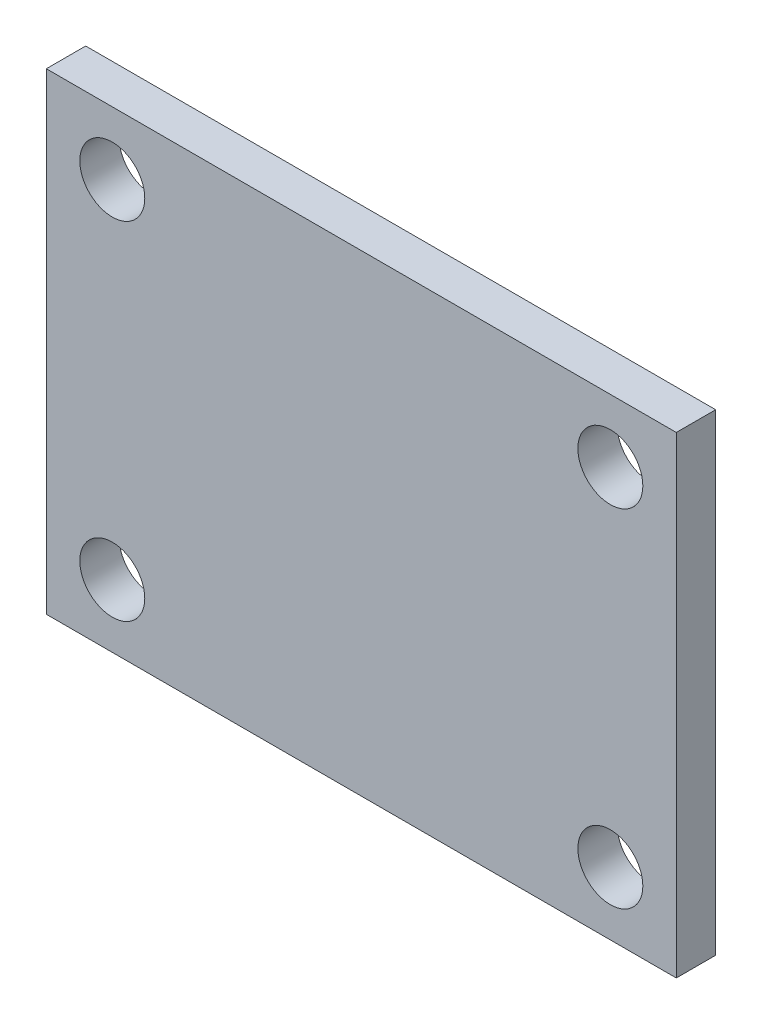
ISO-10303-21;
HEADER;
FILE_DESCRIPTION(('STEP AP214'),'2;1');
FILE_NAME('part.step','',(''),(''),'','','');
FILE_SCHEMA(('AUTOMOTIVE_DESIGN { 1 0 10303 214 1 1 1 1 }'));
ENDSEC;
DATA;
#1=APPLICATION_CONTEXT('core data for automotive mechanical design processes');
#2=APPLICATION_PROTOCOL_DEFINITION('international standard','automotive_design',2000,#1);
#3=PRODUCT_CONTEXT('',#1,'mechanical');
#4=PRODUCT('Part','Part','',(#3));
#5=PRODUCT_RELATED_PRODUCT_CATEGORY('part','',(#4));
#6=PRODUCT_DEFINITION_FORMATION('','',#4);
#7=PRODUCT_DEFINITION_CONTEXT('part definition',#1,'design');
#8=PRODUCT_DEFINITION('design','',#6,#7);
#9=PRODUCT_DEFINITION_SHAPE('','',#8);
#10=(LENGTH_UNIT() NAMED_UNIT(*) SI_UNIT(.MILLI.,.METRE.));
#11=(NAMED_UNIT(*) PLANE_ANGLE_UNIT() SI_UNIT($,.RADIAN.));
#12=(NAMED_UNIT(*) SI_UNIT($,.STERADIAN.) SOLID_ANGLE_UNIT());
#13=UNCERTAINTY_MEASURE_WITH_UNIT(LENGTH_MEASURE(1.E-05),#10,'distance_accuracy_value','');
#14=(GEOMETRIC_REPRESENTATION_CONTEXT(3) GLOBAL_UNCERTAINTY_ASSIGNED_CONTEXT((#13)) GLOBAL_UNIT_ASSIGNED_CONTEXT((#10,
#11,#12)) REPRESENTATION_CONTEXT('',''));
#15=CARTESIAN_POINT('',(0.,0.,0.));
#16=DIRECTION('',(0.,0.,1.));
#17=DIRECTION('',(1.,0.,0.));
#18=AXIS2_PLACEMENT_3D('',#15,#16,#17);
#19=CARTESIAN_POINT('',(0.,0.,2.));
#20=DIRECTION('',(0.,0.,-1.));
#21=DIRECTION('',(-1.,0.,0.));
#22=AXIS2_PLACEMENT_3D('',#19,#20,#21);
#23=PLANE('',#22);
#24=DIRECTION('',(0.,1.,0.));
#25=VECTOR('',#24,1.);
#26=CARTESIAN_POINT('',(16.,-12.,2.));
#27=LINE('',#26,#25);
#28=CARTESIAN_POINT('',(16.,-12.,2.));
#29=VERTEX_POINT('',#28);
#30=CARTESIAN_POINT('',(16.,12.,2.));
#31=VERTEX_POINT('',#30);
#32=EDGE_CURVE('E89',#29,#31,#27,.T.);
#33=ORIENTED_EDGE('',*,*,#32,.T.);
#34=DIRECTION('',(-1.,0.,0.));
#35=VECTOR('',#34,1.);
#36=CARTESIAN_POINT('',(-16.,12.,2.));
#37=LINE('',#36,#35);
#38=CARTESIAN_POINT('',(-16.,12.,2.));
#39=VERTEX_POINT('',#38);
#40=EDGE_CURVE('E84',#31,#39,#37,.T.);
#41=ORIENTED_EDGE('',*,*,#40,.T.);
#42=DIRECTION('',(0.,-1.,0.));
#43=VECTOR('',#42,1.);
#44=CARTESIAN_POINT('',(-16.,-12.,2.));
#45=LINE('',#44,#43);
#46=CARTESIAN_POINT('',(-16.,-12.,2.));
#47=VERTEX_POINT('',#46);
#48=EDGE_CURVE('E87',#39,#47,#45,.T.);
#49=ORIENTED_EDGE('',*,*,#48,.T.);
#50=DIRECTION('',(1.,0.,0.));
#51=VECTOR('',#50,1.);
#52=CARTESIAN_POINT('',(-16.,-12.,2.));
#53=LINE('',#52,#51);
#54=EDGE_CURVE('E54',#47,#29,#53,.T.);
#55=ORIENTED_EDGE('',*,*,#54,.T.);
#56=EDGE_LOOP('',(#33,#41,#49,#55));
#57=FACE_BOUND('',#56,.T.);
#58=CARTESIAN_POINT('',(-12.65,8.8,2.));
#59=DIRECTION('',(0.,0.,1.));
#60=DIRECTION('',(1.,0.,0.));
#61=AXIS2_PLACEMENT_3D('',#58,#59,#60);
#62=CIRCLE('',#61,1.65);
#63=CARTESIAN_POINT('',(-11.,8.8,2.));
#64=VERTEX_POINT('',#63);
#65=EDGE_CURVE('E104',#64,#64,#62,.T.);
#66=ORIENTED_EDGE('',*,*,#65,.F.);
#67=EDGE_LOOP('',(#66));
#68=FACE_BOUND('',#67,.T.);
#69=CARTESIAN_POINT('',(12.65,8.8,2.));
#70=DIRECTION('',(0.,0.,1.));
#71=DIRECTION('',(1.,0.,0.));
#72=AXIS2_PLACEMENT_3D('',#69,#70,#71);
#73=CIRCLE('',#72,1.65);
#74=CARTESIAN_POINT('',(14.3,8.8,2.));
#75=VERTEX_POINT('',#74);
#76=EDGE_CURVE('E119',#75,#75,#73,.T.);
#77=ORIENTED_EDGE('',*,*,#76,.F.);
#78=EDGE_LOOP('',(#77));
#79=FACE_BOUND('',#78,.T.);
#80=CARTESIAN_POINT('',(12.65,-8.8,2.));
#81=DIRECTION('',(0.,0.,1.));
#82=DIRECTION('',(1.,0.,0.));
#83=AXIS2_PLACEMENT_3D('',#80,#81,#82);
#84=CIRCLE('',#83,1.65);
#85=CARTESIAN_POINT('',(14.3,-8.8,2.));
#86=VERTEX_POINT('',#85);
#87=EDGE_CURVE('E125',#86,#86,#84,.T.);
#88=ORIENTED_EDGE('',*,*,#87,.F.);
#89=EDGE_LOOP('',(#88));
#90=FACE_BOUND('',#89,.T.);
#91=CARTESIAN_POINT('',(-12.65,-8.8,2.));
#92=DIRECTION('',(0.,0.,1.));
#93=DIRECTION('',(1.,0.,0.));
#94=AXIS2_PLACEMENT_3D('',#91,#92,#93);
#95=CIRCLE('',#94,1.65);
#96=CARTESIAN_POINT('',(-11.,-8.8,2.));
#97=VERTEX_POINT('',#96);
#98=EDGE_CURVE('E131',#97,#97,#95,.T.);
#99=ORIENTED_EDGE('',*,*,#98,.F.);
#100=EDGE_LOOP('',(#99));
#101=FACE_BOUND('',#100,.T.);
#102=ADVANCED_FACE('F37',(#57,#68,#79,#90,#101),#23,.F.);
#103=CARTESIAN_POINT('',(0.,0.,0.));
#104=DIRECTION('',(0.,0.,-1.));
#105=DIRECTION('',(-1.,0.,0.));
#106=AXIS2_PLACEMENT_3D('',#103,#104,#105);
#107=PLANE('',#106);
#108=CARTESIAN_POINT('',(12.65,-8.8,0.));
#109=DIRECTION('',(0.,0.,1.));
#110=DIRECTION('',(1.,0.,0.));
#111=AXIS2_PLACEMENT_3D('',#108,#109,#110);
#112=CIRCLE('',#111,1.65);
#113=CARTESIAN_POINT('',(14.3,-8.8,0.));
#114=VERTEX_POINT('',#113);
#115=EDGE_CURVE('E128',#114,#114,#112,.T.);
#116=ORIENTED_EDGE('',*,*,#115,.T.);
#117=EDGE_LOOP('',(#116));
#118=FACE_BOUND('',#117,.T.);
#119=CARTESIAN_POINT('',(-12.65,8.8,0.));
#120=DIRECTION('',(0.,0.,1.));
#121=DIRECTION('',(1.,0.,0.));
#122=AXIS2_PLACEMENT_3D('',#119,#120,#121);
#123=CIRCLE('',#122,1.65);
#124=CARTESIAN_POINT('',(-11.,8.8,0.));
#125=VERTEX_POINT('',#124);
#126=EDGE_CURVE('E116',#125,#125,#123,.T.);
#127=ORIENTED_EDGE('',*,*,#126,.T.);
#128=EDGE_LOOP('',(#127));
#129=FACE_BOUND('',#128,.T.);
#130=DIRECTION('',(0.,1.,0.));
#131=VECTOR('',#130,1.);
#132=CARTESIAN_POINT('',(16.,-12.,0.));
#133=LINE('',#132,#131);
#134=CARTESIAN_POINT('',(16.,-12.,0.));
#135=VERTEX_POINT('',#134);
#136=CARTESIAN_POINT('',(16.,12.,0.));
#137=VERTEX_POINT('',#136);
#138=EDGE_CURVE('E101',#135,#137,#133,.T.);
#139=ORIENTED_EDGE('',*,*,#138,.F.);
#140=DIRECTION('',(1.,0.,0.));
#141=VECTOR('',#140,1.);
#142=CARTESIAN_POINT('',(-16.,-12.,0.));
#143=LINE('',#142,#141);
#144=CARTESIAN_POINT('',(-16.,-12.,0.));
#145=VERTEX_POINT('',#144);
#146=EDGE_CURVE('E77',#145,#135,#143,.T.);
#147=ORIENTED_EDGE('',*,*,#146,.F.);
#148=DIRECTION('',(0.,-1.,0.));
#149=VECTOR('',#148,1.);
#150=CARTESIAN_POINT('',(-16.,-12.,0.));
#151=LINE('',#150,#149);
#152=CARTESIAN_POINT('',(-16.,12.,0.));
#153=VERTEX_POINT('',#152);
#154=EDGE_CURVE('E71',#153,#145,#151,.T.);
#155=ORIENTED_EDGE('',*,*,#154,.F.);
#156=DIRECTION('',(-1.,0.,0.));
#157=VECTOR('',#156,1.);
#158=CARTESIAN_POINT('',(-16.,12.,0.));
#159=LINE('',#158,#157);
#160=EDGE_CURVE('E93',#137,#153,#159,.T.);
#161=ORIENTED_EDGE('',*,*,#160,.F.);
#162=EDGE_LOOP('',(#139,#147,#155,#161));
#163=FACE_BOUND('',#162,.T.);
#164=CARTESIAN_POINT('',(12.65,8.8,0.));
#165=DIRECTION('',(0.,0.,1.));
#166=DIRECTION('',(1.,0.,0.));
#167=AXIS2_PLACEMENT_3D('',#164,#165,#166);
#168=CIRCLE('',#167,1.65);
#169=CARTESIAN_POINT('',(14.3,8.8,0.));
#170=VERTEX_POINT('',#169);
#171=EDGE_CURVE('E122',#170,#170,#168,.T.);
#172=ORIENTED_EDGE('',*,*,#171,.T.);
#173=EDGE_LOOP('',(#172));
#174=FACE_BOUND('',#173,.T.);
#175=CARTESIAN_POINT('',(-12.65,-8.8,0.));
#176=DIRECTION('',(0.,0.,1.));
#177=DIRECTION('',(1.,0.,0.));
#178=AXIS2_PLACEMENT_3D('',#175,#176,#177);
#179=CIRCLE('',#178,1.65);
#180=CARTESIAN_POINT('',(-11.,-8.8,0.));
#181=VERTEX_POINT('',#180);
#182=EDGE_CURVE('E134',#181,#181,#179,.T.);
#183=ORIENTED_EDGE('',*,*,#182,.T.);
#184=EDGE_LOOP('',(#183));
#185=FACE_BOUND('',#184,.T.);
#186=ADVANCED_FACE('F112',(#118,#129,#163,#174,#185),#107,.T.);
#187=CARTESIAN_POINT('',(16.,-12.,2.));
#188=DIRECTION('',(-1.,0.,0.));
#189=DIRECTION('',(0.,0.,1.));
#190=AXIS2_PLACEMENT_3D('',#187,#188,#189);
#191=PLANE('',#190);
#192=ORIENTED_EDGE('',*,*,#138,.T.);
#193=DIRECTION('',(0.,0.,-1.));
#194=VECTOR('',#193,1.);
#195=CARTESIAN_POINT('',(16.,12.,2.));
#196=LINE('',#195,#194);
#197=EDGE_CURVE('E11',#31,#137,#196,.T.);
#198=ORIENTED_EDGE('',*,*,#197,.F.);
#199=ORIENTED_EDGE('',*,*,#32,.F.);
#200=DIRECTION('',(0.,0.,-1.));
#201=VECTOR('',#200,1.);
#202=CARTESIAN_POINT('',(16.,-12.,2.));
#203=LINE('',#202,#201);
#204=EDGE_CURVE('E97',#29,#135,#203,.T.);
#205=ORIENTED_EDGE('',*,*,#204,.T.);
#206=EDGE_LOOP('',(#192,#198,#199,#205));
#207=FACE_BOUND('',#206,.T.);
#208=ADVANCED_FACE('F39',(#207),#191,.F.);
#209=CARTESIAN_POINT('',(-16.,12.,2.));
#210=DIRECTION('',(0.,-1.,0.));
#211=DIRECTION('',(0.,0.,-1.));
#212=AXIS2_PLACEMENT_3D('',#209,#210,#211);
#213=PLANE('',#212);
#214=ORIENTED_EDGE('',*,*,#160,.T.);
#215=DIRECTION('',(0.,0.,-1.));
#216=VECTOR('',#215,1.);
#217=CARTESIAN_POINT('',(-16.,12.,2.));
#218=LINE('',#217,#216);
#219=EDGE_CURVE('E46',#39,#153,#218,.T.);
#220=ORIENTED_EDGE('',*,*,#219,.F.);
#221=ORIENTED_EDGE('',*,*,#40,.F.);
#222=ORIENTED_EDGE('',*,*,#197,.T.);
#223=EDGE_LOOP('',(#214,#220,#221,#222));
#224=FACE_BOUND('',#223,.T.);
#225=ADVANCED_FACE('F92',(#224),#213,.F.);
#226=CARTESIAN_POINT('',(-16.,-12.,2.));
#227=DIRECTION('',(1.,0.,0.));
#228=DIRECTION('',(0.,0.,-1.));
#229=AXIS2_PLACEMENT_3D('',#226,#227,#228);
#230=PLANE('',#229);
#231=ORIENTED_EDGE('',*,*,#154,.T.);
#232=DIRECTION('',(0.,0.,-1.));
#233=VECTOR('',#232,1.);
#234=CARTESIAN_POINT('',(-16.,-12.,2.));
#235=LINE('',#234,#233);
#236=EDGE_CURVE('E94',#47,#145,#235,.T.);
#237=ORIENTED_EDGE('',*,*,#236,.F.);
#238=ORIENTED_EDGE('',*,*,#48,.F.);
#239=ORIENTED_EDGE('',*,*,#219,.T.);
#240=EDGE_LOOP('',(#231,#237,#238,#239));
#241=FACE_BOUND('',#240,.T.);
#242=ADVANCED_FACE('F95',(#241),#230,.F.);
#243=CARTESIAN_POINT('',(-16.,-12.,2.));
#244=DIRECTION('',(0.,1.,0.));
#245=DIRECTION('',(0.,0.,1.));
#246=AXIS2_PLACEMENT_3D('',#243,#244,#245);
#247=PLANE('',#246);
#248=ORIENTED_EDGE('',*,*,#146,.T.);
#249=ORIENTED_EDGE('',*,*,#204,.F.);
#250=ORIENTED_EDGE('',*,*,#54,.F.);
#251=ORIENTED_EDGE('',*,*,#236,.T.);
#252=EDGE_LOOP('',(#248,#249,#250,#251));
#253=FACE_BOUND('',#252,.T.);
#254=ADVANCED_FACE('F109',(#253),#247,.F.);
#255=CARTESIAN_POINT('',(-12.65,8.8,2.));
#256=DIRECTION('',(0.,0.,-1.));
#257=DIRECTION('',(-1.,0.,0.));
#258=AXIS2_PLACEMENT_3D('',#255,#256,#257);
#259=CYLINDRICAL_SURFACE('',#258,1.65);
#260=ORIENTED_EDGE('',*,*,#65,.T.);
#261=EDGE_LOOP('',(#260));
#262=FACE_BOUND('',#261,.T.);
#263=ORIENTED_EDGE('',*,*,#126,.F.);
#264=EDGE_LOOP('',(#263));
#265=FACE_BOUND('',#264,.T.);
#266=ADVANCED_FACE('F151',(#262,#265),#259,.F.);
#267=CARTESIAN_POINT('',(12.65,8.8,2.));
#268=DIRECTION('',(0.,0.,-1.));
#269=DIRECTION('',(-1.,0.,0.));
#270=AXIS2_PLACEMENT_3D('',#267,#268,#269);
#271=CYLINDRICAL_SURFACE('',#270,1.65);
#272=ORIENTED_EDGE('',*,*,#76,.T.);
#273=EDGE_LOOP('',(#272));
#274=FACE_BOUND('',#273,.T.);
#275=ORIENTED_EDGE('',*,*,#171,.F.);
#276=EDGE_LOOP('',(#275));
#277=FACE_BOUND('',#276,.T.);
#278=ADVANCED_FACE('F197',(#274,#277),#271,.F.);
#279=CARTESIAN_POINT('',(12.65,-8.8,2.));
#280=DIRECTION('',(0.,0.,-1.));
#281=DIRECTION('',(-1.,0.,0.));
#282=AXIS2_PLACEMENT_3D('',#279,#280,#281);
#283=CYLINDRICAL_SURFACE('',#282,1.65);
#284=ORIENTED_EDGE('',*,*,#87,.T.);
#285=EDGE_LOOP('',(#284));
#286=FACE_BOUND('',#285,.T.);
#287=ORIENTED_EDGE('',*,*,#115,.F.);
#288=EDGE_LOOP('',(#287));
#289=FACE_BOUND('',#288,.T.);
#290=ADVANCED_FACE('F205',(#286,#289),#283,.F.);
#291=CARTESIAN_POINT('',(-12.65,-8.8,2.));
#292=DIRECTION('',(0.,0.,-1.));
#293=DIRECTION('',(-1.,0.,0.));
#294=AXIS2_PLACEMENT_3D('',#291,#292,#293);
#295=CYLINDRICAL_SURFACE('',#294,1.65);
#296=ORIENTED_EDGE('',*,*,#98,.T.);
#297=EDGE_LOOP('',(#296));
#298=FACE_BOUND('',#297,.T.);
#299=ORIENTED_EDGE('',*,*,#182,.F.);
#300=EDGE_LOOP('',(#299));
#301=FACE_BOUND('',#300,.T.);
#302=ADVANCED_FACE('F140',(#298,#301),#295,.F.);
#303=CLOSED_SHELL('',(#102,#186,#208,#225,#242,#254,#266,#278,#290,#302));
#304=MANIFOLD_SOLID_BREP('B2',#303);
#305=ADVANCED_BREP_SHAPE_REPRESENTATION('',(#18,#304),#14);
#306=SHAPE_DEFINITION_REPRESENTATION(#9,#305);
ENDSEC;
END-ISO-10303-21;
